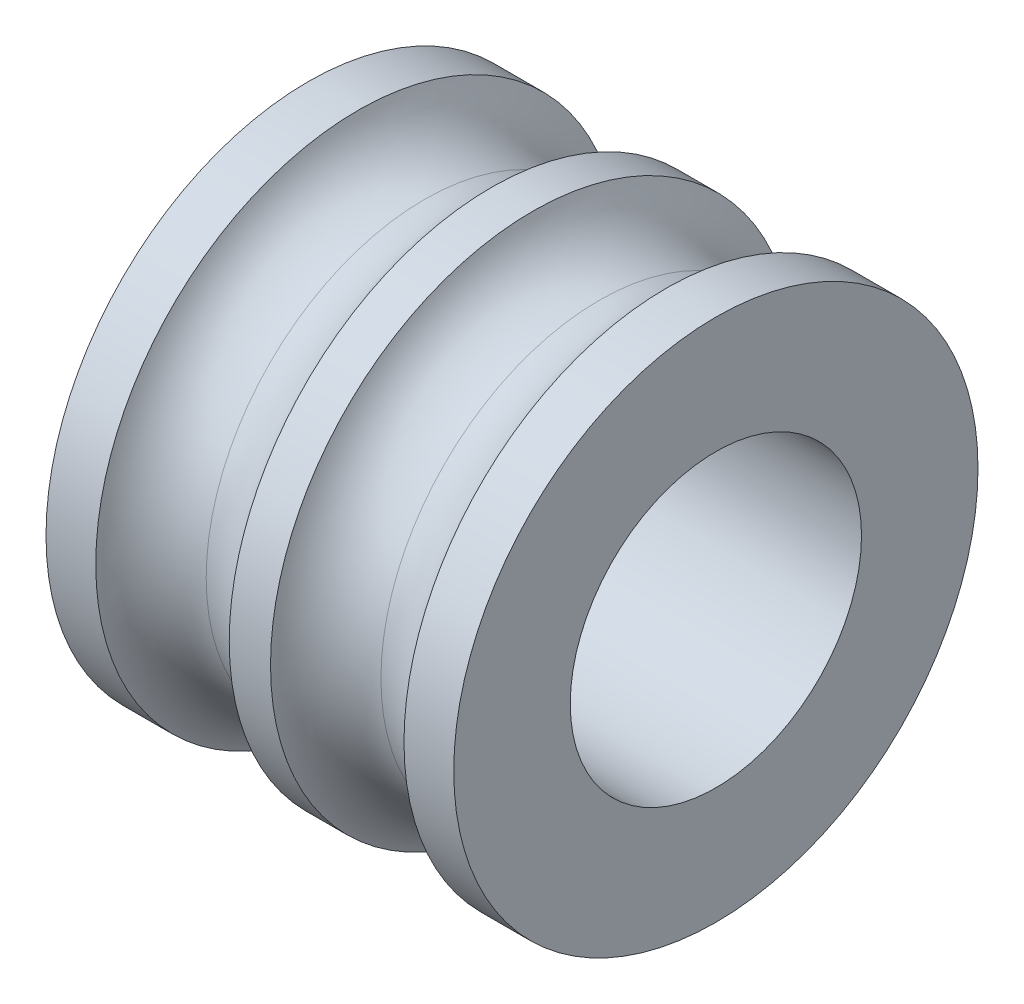
ISO-10303-21;
HEADER;
FILE_DESCRIPTION(('STEP AP214'),'2;1');
FILE_NAME('part.step','',(''),(''),'','','');
FILE_SCHEMA(('AUTOMOTIVE_DESIGN { 1 0 10303 214 1 1 1 1 }'));
ENDSEC;
DATA;
#1=APPLICATION_CONTEXT('core data for automotive mechanical design processes');
#2=APPLICATION_PROTOCOL_DEFINITION('international standard','automotive_design',2000,#1);
#3=PRODUCT_CONTEXT('',#1,'mechanical');
#4=PRODUCT('Part','Part','',(#3));
#5=PRODUCT_RELATED_PRODUCT_CATEGORY('part','',(#4));
#6=PRODUCT_DEFINITION_FORMATION('','',#4);
#7=PRODUCT_DEFINITION_CONTEXT('part definition',#1,'design');
#8=PRODUCT_DEFINITION('design','',#6,#7);
#9=PRODUCT_DEFINITION_SHAPE('','',#8);
#10=(LENGTH_UNIT() NAMED_UNIT(*) SI_UNIT(.MILLI.,.METRE.));
#11=(NAMED_UNIT(*) PLANE_ANGLE_UNIT() SI_UNIT($,.RADIAN.));
#12=(NAMED_UNIT(*) SI_UNIT($,.STERADIAN.) SOLID_ANGLE_UNIT());
#13=UNCERTAINTY_MEASURE_WITH_UNIT(LENGTH_MEASURE(1.E-05),#10,'distance_accuracy_value','');
#14=(GEOMETRIC_REPRESENTATION_CONTEXT(3) GLOBAL_UNCERTAINTY_ASSIGNED_CONTEXT((#13)) GLOBAL_UNIT_ASSIGNED_CONTEXT((#10,
#11,#12)) REPRESENTATION_CONTEXT('',''));
#15=CARTESIAN_POINT('',(0.,0.,0.));
#16=DIRECTION('',(0.,0.,1.));
#17=DIRECTION('',(1.,0.,0.));
#18=AXIS2_PLACEMENT_3D('',#15,#16,#17);
#19=CARTESIAN_POINT('',(7.70871215252208,0.,0.));
#20=DIRECTION('',(-1.,0.,0.));
#21=DIRECTION('',(0.,0.,1.));
#22=AXIS2_PLACEMENT_3D('',#19,#20,#21);
#23=CYLINDRICAL_SURFACE('',#22,9.00000000000001);
#24=CARTESIAN_POINT('',(6.29128784747792,0.,0.));
#25=DIRECTION('',(-1.,0.,0.));
#26=DIRECTION('',(0.,0.,1.));
#27=AXIS2_PLACEMENT_3D('',#24,#25,#26);
#28=CIRCLE('',#27,9.00000000000001);
#29=CARTESIAN_POINT('',(6.29128784747792,0.,9.00000000000001));
#30=VERTEX_POINT('',#29);
#31=EDGE_CURVE('E60',#30,#30,#28,.F.);
#32=ORIENTED_EDGE('',*,*,#31,.T.);
#33=EDGE_LOOP('',(#32));
#34=FACE_BOUND('',#33,.T.);
#35=CARTESIAN_POINT('',(7.70871215252208,0.,0.));
#36=DIRECTION('',(-1.,0.,0.));
#37=DIRECTION('',(0.,0.,1.));
#38=AXIS2_PLACEMENT_3D('',#35,#36,#37);
#39=CIRCLE('',#38,9.00000000000001);
#40=CARTESIAN_POINT('',(7.70871215252208,0.,9.00000000000001));
#41=VERTEX_POINT('',#40);
#42=EDGE_CURVE('E65',#41,#41,#39,.T.);
#43=ORIENTED_EDGE('',*,*,#42,.T.);
#44=EDGE_LOOP('',(#43));
#45=FACE_BOUND('',#44,.T.);
#46=ADVANCED_FACE('F15',(#34,#45),#23,.T.);
#47=CARTESIAN_POINT('',(10.,10.112712429687,7.3473156536559));
#48=CARTESIAN_POINT('',(12.5,10.112712429687,7.3473156536559));
#49=CARTESIAN_POINT('',(12.5,8.0901699437495,5.8778525229247));
#50=CARTESIAN_POINT('',(12.5,6.0676274578121,4.4083893921935));
#51=CARTESIAN_POINT('',(10.,6.0676274578121,4.4083893921935));
#52=(BOUNDED_CURVE() B_SPLINE_CURVE(2,(#47,#48,#49,#50,#51),.UNSPECIFIED.,.F.,
.F.) B_SPLINE_CURVE_WITH_KNOTS((3,2,3),(0.,0.25,0.5),
.UNSPECIFIED.) CURVE() GEOMETRIC_REPRESENTATION_ITEM() RATIONAL_B_SPLINE_CURVE((1.,
0.70710678118655,1.,0.70710678118655,1.)) REPRESENTATION_ITEM(''));
#53=CARTESIAN_POINT('',(12.5,0.,0.));
#54=DIRECTION('',(-1.,0.,0.));
#55=AXIS1_PLACEMENT('',#53,#54);
#56=SURFACE_OF_REVOLUTION('',#52,#55);
#57=CARTESIAN_POINT('',(12.2912878474779,0.,0.));
#58=DIRECTION('',(-1.,0.,0.));
#59=DIRECTION('',(0.,0.,1.));
#60=AXIS2_PLACEMENT_3D('',#57,#58,#59);
#61=CIRCLE('',#60,9.00000000000001);
#62=CARTESIAN_POINT('',(12.2912878474779,0.,9.00000000000001));
#63=VERTEX_POINT('',#62);
#64=EDGE_CURVE('E52',#63,#63,#61,.T.);
#65=ORIENTED_EDGE('',*,*,#64,.T.);
#66=EDGE_LOOP('',(#65));
#67=FACE_BOUND('',#66,.T.);
#68=CARTESIAN_POINT('',(10.,0.,0.));
#69=DIRECTION('',(-1.,0.,0.));
#70=DIRECTION('',(0.,0.80901699437495,0.587785252292469));
#71=AXIS2_PLACEMENT_3D('',#68,#69,#70);
#72=CIRCLE('',#71,7.49999999999997);
#73=CARTESIAN_POINT('',(10.,6.0676274578121,4.4083893921935));
#74=VERTEX_POINT('',#73);
#75=EDGE_CURVE('E63',#74,#74,#72,.T.);
#76=ORIENTED_EDGE('',*,*,#75,.F.);
#77=EDGE_LOOP('',(#76));
#78=FACE_BOUND('',#77,.T.);
#79=ADVANCED_FACE('F88',(#67,#78),#56,.T.);
#80=CARTESIAN_POINT('',(10.,6.0676274578121,4.4083893921935));
#81=CARTESIAN_POINT('',(7.5,6.0676274578121,4.4083893921935));
#82=CARTESIAN_POINT('',(7.5,8.0901699437495,5.8778525229247));
#83=CARTESIAN_POINT('',(7.5,10.112712429687,7.3473156536559));
#84=CARTESIAN_POINT('',(10.,10.112712429687,7.3473156536559));
#85=(BOUNDED_CURVE() B_SPLINE_CURVE(2,(#80,#81,#82,#83,#84),.UNSPECIFIED.,.F.,
.F.) B_SPLINE_CURVE_WITH_KNOTS((3,2,3),(0.5,0.75,1.),
.UNSPECIFIED.) CURVE() GEOMETRIC_REPRESENTATION_ITEM() RATIONAL_B_SPLINE_CURVE((1.,
0.70710678118655,1.,0.70710678118655,1.)) REPRESENTATION_ITEM(''));
#86=CARTESIAN_POINT('',(12.5,0.,0.));
#87=DIRECTION('',(-1.,0.,0.));
#88=AXIS1_PLACEMENT('',#86,#87);
#89=SURFACE_OF_REVOLUTION('',#85,#88);
#90=ORIENTED_EDGE('',*,*,#75,.T.);
#91=EDGE_LOOP('',(#90));
#92=FACE_BOUND('',#91,.T.);
#93=ORIENTED_EDGE('',*,*,#42,.F.);
#94=EDGE_LOOP('',(#93));
#95=FACE_BOUND('',#94,.T.);
#96=ADVANCED_FACE('F92',(#92,#95),#89,.T.);
#97=CARTESIAN_POINT('',(4.,10.112712429687,7.3473156536559));
#98=CARTESIAN_POINT('',(6.5,10.112712429687,7.3473156536559));
#99=CARTESIAN_POINT('',(6.5,8.0901699437495,5.8778525229247));
#100=CARTESIAN_POINT('',(6.5,6.0676274578121,4.4083893921935));
#101=CARTESIAN_POINT('',(4.,6.0676274578121,4.4083893921935));
#102=(BOUNDED_CURVE() B_SPLINE_CURVE(2,(#97,#98,#99,#100,#101),.UNSPECIFIED.,.F.,
.F.) B_SPLINE_CURVE_WITH_KNOTS((3,2,3),(0.,0.25,0.5),
.UNSPECIFIED.) CURVE() GEOMETRIC_REPRESENTATION_ITEM() RATIONAL_B_SPLINE_CURVE((1.,
0.70710678118655,1.,0.70710678118655,1.)) REPRESENTATION_ITEM(''));
#103=CARTESIAN_POINT('',(6.5,0.,0.));
#104=DIRECTION('',(-1.,0.,0.));
#105=AXIS1_PLACEMENT('',#103,#104);
#106=SURFACE_OF_REVOLUTION('',#102,#105);
#107=ORIENTED_EDGE('',*,*,#31,.F.);
#108=EDGE_LOOP('',(#107));
#109=FACE_BOUND('',#108,.T.);
#110=CARTESIAN_POINT('',(4.,0.,0.));
#111=DIRECTION('',(-1.,0.,0.));
#112=DIRECTION('',(0.,0.80901699437495,0.587785252292469));
#113=AXIS2_PLACEMENT_3D('',#110,#111,#112);
#114=CIRCLE('',#113,7.49999999999997);
#115=CARTESIAN_POINT('',(4.,6.0676274578121,4.4083893921935));
#116=VERTEX_POINT('',#115);
#117=EDGE_CURVE('E57',#116,#116,#114,.T.);
#118=ORIENTED_EDGE('',*,*,#117,.F.);
#119=EDGE_LOOP('',(#118));
#120=FACE_BOUND('',#119,.T.);
#121=ADVANCED_FACE('F96',(#109,#120),#106,.T.);
#122=CARTESIAN_POINT('',(4.,6.0676274578121,4.4083893921935));
#123=CARTESIAN_POINT('',(1.5,6.0676274578121,4.4083893921935));
#124=CARTESIAN_POINT('',(1.5,8.0901699437495,5.8778525229247));
#125=CARTESIAN_POINT('',(1.5,10.112712429687,7.3473156536559));
#126=CARTESIAN_POINT('',(4.,10.112712429687,7.3473156536559));
#127=(BOUNDED_CURVE() B_SPLINE_CURVE(2,(#122,#123,#124,#125,#126),.UNSPECIFIED.,.F.,
.F.) B_SPLINE_CURVE_WITH_KNOTS((3,2,3),(0.5,0.75,1.),
.UNSPECIFIED.) CURVE() GEOMETRIC_REPRESENTATION_ITEM() RATIONAL_B_SPLINE_CURVE((1.,
0.70710678118655,1.,0.70710678118655,1.)) REPRESENTATION_ITEM(''));
#128=CARTESIAN_POINT('',(6.5,0.,0.));
#129=DIRECTION('',(-1.,0.,0.));
#130=AXIS1_PLACEMENT('',#128,#129);
#131=SURFACE_OF_REVOLUTION('',#127,#130);
#132=ORIENTED_EDGE('',*,*,#117,.T.);
#133=EDGE_LOOP('',(#132));
#134=FACE_BOUND('',#133,.T.);
#135=CARTESIAN_POINT('',(1.70871215252206,0.,0.));
#136=DIRECTION('',(-1.,0.,0.));
#137=DIRECTION('',(0.,0.,1.));
#138=AXIS2_PLACEMENT_3D('',#135,#136,#137);
#139=CIRCLE('',#138,9.00000000000001);
#140=CARTESIAN_POINT('',(1.70871215252206,0.,9.00000000000001));
#141=VERTEX_POINT('',#140);
#142=EDGE_CURVE('E42',#141,#141,#139,.F.);
#143=ORIENTED_EDGE('',*,*,#142,.T.);
#144=EDGE_LOOP('',(#143));
#145=FACE_BOUND('',#144,.T.);
#146=ADVANCED_FACE('F99',(#134,#145),#131,.T.);
#147=CARTESIAN_POINT('',(14.,0.,0.));
#148=DIRECTION('',(-1.,0.,0.));
#149=DIRECTION('',(0.,0.,1.));
#150=AXIS2_PLACEMENT_3D('',#147,#148,#149);
#151=CYLINDRICAL_SURFACE('',#150,9.00000000000001);
#152=ORIENTED_EDGE('',*,*,#64,.F.);
#153=EDGE_LOOP('',(#152));
#154=FACE_BOUND('',#153,.T.);
#155=CARTESIAN_POINT('',(14.,0.,0.));
#156=DIRECTION('',(-1.,0.,0.));
#157=DIRECTION('',(0.,0.,1.));
#158=AXIS2_PLACEMENT_3D('',#155,#156,#157);
#159=CIRCLE('',#158,9.00000000000001);
#160=CARTESIAN_POINT('',(14.,0.,9.00000000000001));
#161=VERTEX_POINT('',#160);
#162=EDGE_CURVE('E47',#161,#161,#159,.F.);
#163=ORIENTED_EDGE('',*,*,#162,.F.);
#164=EDGE_LOOP('',(#163));
#165=FACE_BOUND('',#164,.T.);
#166=ADVANCED_FACE('F116',(#154,#165),#151,.T.);
#167=CARTESIAN_POINT('',(14.,-1.9910856787423,-12.571220220007));
#168=DIRECTION('',(1.,0.,0.));
#169=DIRECTION('',(0.,0.809016994374947,0.587785252292473));
#170=AXIS2_PLACEMENT_3D('',#167,#168,#169);
#171=PLANE('',#170);
#172=CARTESIAN_POINT('',(14.,0.,0.));
#173=DIRECTION('',(-1.,0.,0.));
#174=DIRECTION('',(0.,0.,1.));
#175=AXIS2_PLACEMENT_3D('',#172,#173,#174);
#176=CIRCLE('',#175,4.99999999999999);
#177=CARTESIAN_POINT('',(14.,0.,4.99999999999999));
#178=VERTEX_POINT('',#177);
#179=EDGE_CURVE('E28',#178,#178,#176,.F.);
#180=ORIENTED_EDGE('',*,*,#179,.F.);
#181=EDGE_LOOP('',(#180));
#182=FACE_BOUND('',#181,.T.);
#183=ORIENTED_EDGE('',*,*,#162,.T.);
#184=EDGE_LOOP('',(#183));
#185=FACE_BOUND('',#184,.T.);
#186=ADVANCED_FACE('F122',(#182,#185),#171,.T.);
#187=CARTESIAN_POINT('',(1.70871215252206,0.,0.));
#188=DIRECTION('',(-1.,0.,0.));
#189=DIRECTION('',(0.,0.,1.));
#190=AXIS2_PLACEMENT_3D('',#187,#188,#189);
#191=CYLINDRICAL_SURFACE('',#190,9.00000000000001);
#192=CARTESIAN_POINT('',(0.,0.,0.));
#193=DIRECTION('',(-1.,0.,0.));
#194=DIRECTION('',(0.,0.,1.));
#195=AXIS2_PLACEMENT_3D('',#192,#193,#194);
#196=CIRCLE('',#195,9.00000000000001);
#197=CARTESIAN_POINT('',(0.,0.,9.00000000000001));
#198=VERTEX_POINT('',#197);
#199=EDGE_CURVE('E23',#198,#198,#196,.T.);
#200=ORIENTED_EDGE('',*,*,#199,.F.);
#201=EDGE_LOOP('',(#200));
#202=FACE_BOUND('',#201,.T.);
#203=ORIENTED_EDGE('',*,*,#142,.F.);
#204=EDGE_LOOP('',(#203));
#205=FACE_BOUND('',#204,.T.);
#206=ADVANCED_FACE('F119',(#202,#205),#191,.T.);
#207=CARTESIAN_POINT('',(14.,0.,0.));
#208=DIRECTION('',(-1.,0.,0.));
#209=DIRECTION('',(0.,0.,1.));
#210=AXIS2_PLACEMENT_3D('',#207,#208,#209);
#211=CYLINDRICAL_SURFACE('',#210,4.99999999999999);
#212=CARTESIAN_POINT('',(0.,0.,0.));
#213=DIRECTION('',(-1.,0.,0.));
#214=DIRECTION('',(0.,0.,1.));
#215=AXIS2_PLACEMENT_3D('',#212,#213,#214);
#216=CIRCLE('',#215,4.99999999999999);
#217=CARTESIAN_POINT('',(0.,0.,4.99999999999999));
#218=VERTEX_POINT('',#217);
#219=EDGE_CURVE('E10',#218,#218,#216,.F.);
#220=ORIENTED_EDGE('',*,*,#219,.F.);
#221=EDGE_LOOP('',(#220));
#222=FACE_BOUND('',#221,.T.);
#223=ORIENTED_EDGE('',*,*,#179,.T.);
#224=EDGE_LOOP('',(#223));
#225=FACE_BOUND('',#224,.T.);
#226=ADVANCED_FACE('F121',(#222,#225),#211,.F.);
#227=CARTESIAN_POINT('',(0.,-12.571220220007,1.9910856787423));
#228=DIRECTION('',(-1.,0.,0.));
#229=DIRECTION('',(0.,0.809016994374947,0.587785252292473));
#230=AXIS2_PLACEMENT_3D('',#227,#228,#229);
#231=PLANE('',#230);
#232=ORIENTED_EDGE('',*,*,#219,.T.);
#233=EDGE_LOOP('',(#232));
#234=FACE_BOUND('',#233,.T.);
#235=ORIENTED_EDGE('',*,*,#199,.T.);
#236=EDGE_LOOP('',(#235));
#237=FACE_BOUND('',#236,.T.);
#238=ADVANCED_FACE('F17',(#234,#237),#231,.T.);
#239=CLOSED_SHELL('',(#46,#79,#96,#121,#146,#166,#186,#206,#226,#238));
#240=MANIFOLD_SOLID_BREP('B1',#239);
#241=ADVANCED_BREP_SHAPE_REPRESENTATION('',(#18,#240),#14);
#242=SHAPE_DEFINITION_REPRESENTATION(#9,#241);
ENDSEC;
END-ISO-10303-21;
